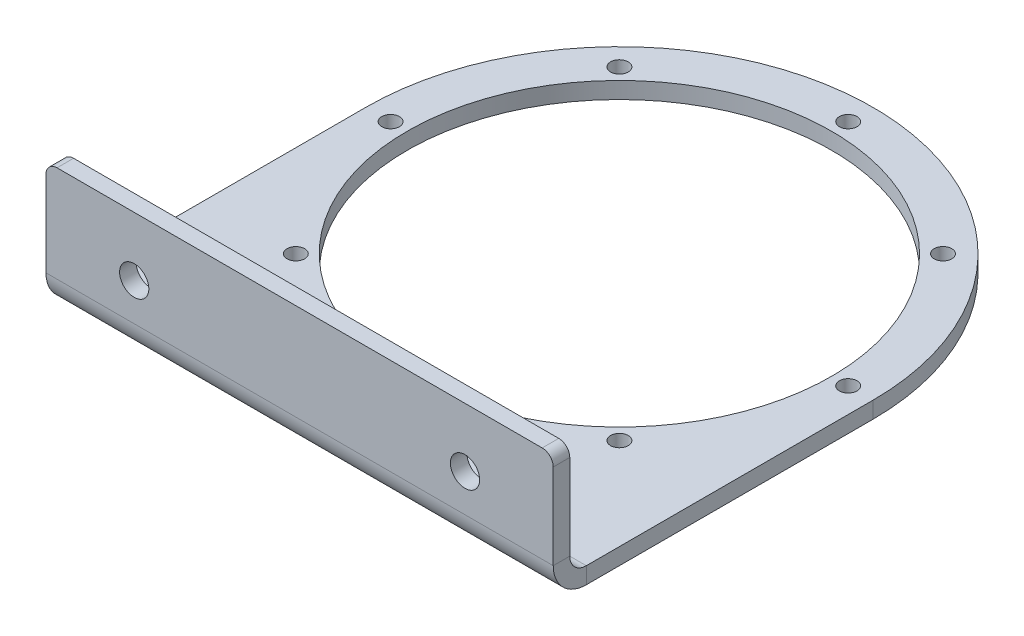
ISO-10303-21;
HEADER;
FILE_DESCRIPTION(('STEP AP214'),'2;1');
FILE_NAME('part.step','',(''),(''),'','','');
FILE_SCHEMA(('AUTOMOTIVE_DESIGN { 1 0 10303 214 1 1 1 1 }'));
ENDSEC;
DATA;
#1=APPLICATION_CONTEXT('core data for automotive mechanical design processes');
#2=APPLICATION_PROTOCOL_DEFINITION('international standard','automotive_design',2000,#1);
#3=PRODUCT_CONTEXT('',#1,'mechanical');
#4=PRODUCT('Part','Part','',(#3));
#5=PRODUCT_RELATED_PRODUCT_CATEGORY('part','',(#4));
#6=PRODUCT_DEFINITION_FORMATION('','',#4);
#7=PRODUCT_DEFINITION_CONTEXT('part definition',#1,'design');
#8=PRODUCT_DEFINITION('design','',#6,#7);
#9=PRODUCT_DEFINITION_SHAPE('','',#8);
#10=(LENGTH_UNIT() NAMED_UNIT(*) SI_UNIT(.MILLI.,.METRE.));
#11=(NAMED_UNIT(*) PLANE_ANGLE_UNIT() SI_UNIT($,.RADIAN.));
#12=(NAMED_UNIT(*) SI_UNIT($,.STERADIAN.) SOLID_ANGLE_UNIT());
#13=UNCERTAINTY_MEASURE_WITH_UNIT(LENGTH_MEASURE(1.E-05),#10,'distance_accuracy_value','');
#14=(GEOMETRIC_REPRESENTATION_CONTEXT(3) GLOBAL_UNCERTAINTY_ASSIGNED_CONTEXT((#13)) GLOBAL_UNIT_ASSIGNED_CONTEXT((#10,
#11,#12)) REPRESENTATION_CONTEXT('',''));
#15=CARTESIAN_POINT('',(0.,0.,0.));
#16=DIRECTION('',(0.,0.,1.));
#17=DIRECTION('',(1.,0.,0.));
#18=AXIS2_PLACEMENT_3D('',#15,#16,#17);
#19=CARTESIAN_POINT('',(46.,-3.,55.));
#20=DIRECTION('',(1.,0.,0.));
#21=DIRECTION('',(0.,0.,-1.));
#22=AXIS2_PLACEMENT_3D('',#19,#20,#21);
#23=PLANE('',#22);
#24=DIRECTION('',(0.,0.,-1.));
#25=VECTOR('',#24,1.);
#26=CARTESIAN_POINT('',(46.,0.,55.));
#27=LINE('',#26,#25);
#28=CARTESIAN_POINT('',(46.,0.,52.));
#29=VERTEX_POINT('',#28);
#30=CARTESIAN_POINT('',(46.,0.,0.));
#31=VERTEX_POINT('',#30);
#32=EDGE_CURVE('E195',#29,#31,#27,.T.);
#33=ORIENTED_EDGE('',*,*,#32,.F.);
#34=DIRECTION('',(0.,-1.,0.));
#35=VECTOR('',#34,1.);
#36=CARTESIAN_POINT('',(46.,0.,52.));
#37=LINE('',#36,#35);
#38=CARTESIAN_POINT('',(46.,-3.00000000000001,52.));
#39=VERTEX_POINT('',#38);
#40=EDGE_CURVE('E171',#29,#39,#37,.T.);
#41=ORIENTED_EDGE('',*,*,#40,.T.);
#42=DIRECTION('',(0.,0.,-1.));
#43=VECTOR('',#42,1.);
#44=CARTESIAN_POINT('',(46.,-3.,55.));
#45=LINE('',#44,#43);
#46=CARTESIAN_POINT('',(46.,-3.,0.));
#47=VERTEX_POINT('',#46);
#48=EDGE_CURVE('E198',#39,#47,#45,.T.);
#49=ORIENTED_EDGE('',*,*,#48,.T.);
#50=DIRECTION('',(0.,1.,0.));
#51=VECTOR('',#50,1.);
#52=CARTESIAN_POINT('',(46.,-3.,0.));
#53=LINE('',#52,#51);
#54=EDGE_CURVE('E207',#47,#31,#53,.T.);
#55=ORIENTED_EDGE('',*,*,#54,.T.);
#56=EDGE_LOOP('',(#33,#41,#49,#55));
#57=FACE_BOUND('',#56,.T.);
#58=ADVANCED_FACE('F45',(#57),#23,.T.);
#59=CARTESIAN_POINT('',(0.,-3.,0.));
#60=DIRECTION('',(0.,1.,0.));
#61=DIRECTION('',(0.,0.,1.));
#62=AXIS2_PLACEMENT_3D('',#59,#60,#61);
#63=PLANE('',#62);
#64=CARTESIAN_POINT('',(-29.3449314192417,-3.,-29.3449314192417));
#65=DIRECTION('',(0.,1.,0.));
#66=DIRECTION('',(0.,0.,1.));
#67=AXIS2_PLACEMENT_3D('',#64,#65,#66);
#68=CIRCLE('',#67,1.59999999999998);
#69=CARTESIAN_POINT('',(-29.3449314192417,-3.,-27.7449314192417));
#70=VERTEX_POINT('',#69);
#71=EDGE_CURVE('E229',#70,#70,#68,.T.);
#72=ORIENTED_EDGE('',*,*,#71,.T.);
#73=EDGE_LOOP('',(#72));
#74=FACE_BOUND('',#73,.T.);
#75=CARTESIAN_POINT('',(0.,-3.,-41.5));
#76=DIRECTION('',(0.,1.,0.));
#77=DIRECTION('',(0.,0.,1.));
#78=AXIS2_PLACEMENT_3D('',#75,#76,#77);
#79=CIRCLE('',#78,1.59999999999998);
#80=CARTESIAN_POINT('',(0.,-3.,-39.9));
#81=VERTEX_POINT('',#80);
#82=EDGE_CURVE('E244',#81,#81,#79,.T.);
#83=ORIENTED_EDGE('',*,*,#82,.T.);
#84=EDGE_LOOP('',(#83));
#85=FACE_BOUND('',#84,.T.);
#86=CARTESIAN_POINT('',(-41.5,-3.,0.));
#87=DIRECTION('',(0.,1.,0.));
#88=DIRECTION('',(0.,0.,1.));
#89=AXIS2_PLACEMENT_3D('',#86,#87,#88);
#90=CIRCLE('',#89,1.59999999999998);
#91=CARTESIAN_POINT('',(-41.5,-3.,1.59999999999999));
#92=VERTEX_POINT('',#91);
#93=EDGE_CURVE('E250',#92,#92,#90,.T.);
#94=ORIENTED_EDGE('',*,*,#93,.T.);
#95=EDGE_LOOP('',(#94));
#96=FACE_BOUND('',#95,.T.);
#97=CARTESIAN_POINT('',(-29.3449314192417,-3.,29.3449314192417));
#98=DIRECTION('',(0.,1.,0.));
#99=DIRECTION('',(0.,0.,1.));
#100=AXIS2_PLACEMENT_3D('',#97,#98,#99);
#101=CIRCLE('',#100,1.59999999999998);
#102=CARTESIAN_POINT('',(-29.3449314192417,-3.,30.9449314192417));
#103=VERTEX_POINT('',#102);
#104=EDGE_CURVE('E256',#103,#103,#101,.T.);
#105=ORIENTED_EDGE('',*,*,#104,.T.);
#106=EDGE_LOOP('',(#105));
#107=FACE_BOUND('',#106,.T.);
#108=CARTESIAN_POINT('',(0.,-3.,41.5));
#109=DIRECTION('',(0.,1.,0.));
#110=DIRECTION('',(0.,0.,1.));
#111=AXIS2_PLACEMENT_3D('',#108,#109,#110);
#112=CIRCLE('',#111,1.59999999999998);
#113=CARTESIAN_POINT('',(0.,-3.,43.1));
#114=VERTEX_POINT('',#113);
#115=EDGE_CURVE('E262',#114,#114,#112,.T.);
#116=ORIENTED_EDGE('',*,*,#115,.T.);
#117=EDGE_LOOP('',(#116));
#118=FACE_BOUND('',#117,.T.);
#119=CARTESIAN_POINT('',(29.3449314192417,-3.,29.3449314192417));
#120=DIRECTION('',(0.,1.,0.));
#121=DIRECTION('',(0.,0.,1.));
#122=AXIS2_PLACEMENT_3D('',#119,#120,#121);
#123=CIRCLE('',#122,1.59999999999998);
#124=CARTESIAN_POINT('',(29.3449314192417,-3.,30.9449314192417));
#125=VERTEX_POINT('',#124);
#126=EDGE_CURVE('E268',#125,#125,#123,.T.);
#127=ORIENTED_EDGE('',*,*,#126,.T.);
#128=EDGE_LOOP('',(#127));
#129=FACE_BOUND('',#128,.T.);
#130=CARTESIAN_POINT('',(41.5,-3.,0.));
#131=DIRECTION('',(0.,1.,0.));
#132=DIRECTION('',(0.,0.,1.));
#133=AXIS2_PLACEMENT_3D('',#130,#131,#132);
#134=CIRCLE('',#133,1.59999999999998);
#135=CARTESIAN_POINT('',(41.5,-3.,1.59999999999998));
#136=VERTEX_POINT('',#135);
#137=EDGE_CURVE('E274',#136,#136,#134,.T.);
#138=ORIENTED_EDGE('',*,*,#137,.T.);
#139=EDGE_LOOP('',(#138));
#140=FACE_BOUND('',#139,.T.);
#141=CARTESIAN_POINT('',(29.3449314192417,-3.,-29.3449314192417));
#142=DIRECTION('',(0.,1.,0.));
#143=DIRECTION('',(0.,0.,1.));
#144=AXIS2_PLACEMENT_3D('',#141,#142,#143);
#145=CIRCLE('',#144,1.59999999999998);
#146=CARTESIAN_POINT('',(29.3449314192417,-3.,-27.7449314192417));
#147=VERTEX_POINT('',#146);
#148=EDGE_CURVE('E280',#147,#147,#145,.T.);
#149=ORIENTED_EDGE('',*,*,#148,.T.);
#150=EDGE_LOOP('',(#149));
#151=FACE_BOUND('',#150,.T.);
#152=CARTESIAN_POINT('',(0.,-3.,0.));
#153=DIRECTION('',(0.,1.,0.));
#154=DIRECTION('',(0.,0.,1.));
#155=AXIS2_PLACEMENT_3D('',#152,#153,#154);
#156=CIRCLE('',#155,38.5);
#157=CARTESIAN_POINT('',(0.,-3.,38.5));
#158=VERTEX_POINT('',#157);
#159=EDGE_CURVE('E185',#158,#158,#156,.T.);
#160=ORIENTED_EDGE('',*,*,#159,.T.);
#161=EDGE_LOOP('',(#160));
#162=FACE_BOUND('',#161,.T.);
#163=DIRECTION('',(1.,0.,0.));
#164=VECTOR('',#163,1.);
#165=CARTESIAN_POINT('',(46.,-3.00000000000001,52.));
#166=LINE('',#165,#164);
#167=CARTESIAN_POINT('',(-46.,-3.,52.));
#168=VERTEX_POINT('',#167);
#169=EDGE_CURVE('E135',#39,#168,#166,.F.);
#170=ORIENTED_EDGE('',*,*,#169,.T.);
#171=DIRECTION('',(0.,0.,1.));
#172=VECTOR('',#171,1.);
#173=CARTESIAN_POINT('',(-46.,-3.,0.));
#174=LINE('',#173,#172);
#175=CARTESIAN_POINT('',(-46.,-3.,0.));
#176=VERTEX_POINT('',#175);
#177=EDGE_CURVE('E194',#176,#168,#174,.T.);
#178=ORIENTED_EDGE('',*,*,#177,.F.);
#179=CARTESIAN_POINT('',(0.,-3.,0.));
#180=DIRECTION('',(0.,1.,0.));
#181=DIRECTION('',(0.,0.,1.));
#182=AXIS2_PLACEMENT_3D('',#179,#180,#181);
#183=CIRCLE('',#182,46.);
#184=EDGE_CURVE('E191',#47,#176,#183,.T.);
#185=ORIENTED_EDGE('',*,*,#184,.F.);
#186=ORIENTED_EDGE('',*,*,#48,.F.);
#187=EDGE_LOOP('',(#170,#178,#185,#186));
#188=FACE_BOUND('',#187,.T.);
#189=ADVANCED_FACE('F317',(#74,#85,#96,#107,#118,#129,#140,#151,#162,#188),#63,.F.);
#190=CARTESIAN_POINT('',(0.,0.,0.));
#191=DIRECTION('',(0.,1.,0.));
#192=DIRECTION('',(0.,0.,1.));
#193=AXIS2_PLACEMENT_3D('',#190,#191,#192);
#194=PLANE('',#193);
#195=CARTESIAN_POINT('',(-29.3449314192417,0.,-29.3449314192417));
#196=DIRECTION('',(0.,1.,0.));
#197=DIRECTION('',(0.,0.,1.));
#198=AXIS2_PLACEMENT_3D('',#195,#196,#197);
#199=CIRCLE('',#198,1.59999999999999);
#200=CARTESIAN_POINT('',(-29.3449314192417,0.,-27.7449314192417));
#201=VERTEX_POINT('',#200);
#202=EDGE_CURVE('E224',#201,#201,#199,.T.);
#203=ORIENTED_EDGE('',*,*,#202,.F.);
#204=EDGE_LOOP('',(#203));
#205=FACE_BOUND('',#204,.T.);
#206=CARTESIAN_POINT('',(0.,0.,-41.5));
#207=DIRECTION('',(0.,1.,0.));
#208=DIRECTION('',(0.,0.,1.));
#209=AXIS2_PLACEMENT_3D('',#206,#207,#208);
#210=CIRCLE('',#209,1.59999999999999);
#211=CARTESIAN_POINT('',(0.,0.,-39.9));
#212=VERTEX_POINT('',#211);
#213=EDGE_CURVE('E241',#212,#212,#210,.T.);
#214=ORIENTED_EDGE('',*,*,#213,.F.);
#215=EDGE_LOOP('',(#214));
#216=FACE_BOUND('',#215,.T.);
#217=CARTESIAN_POINT('',(-41.5,0.,0.));
#218=DIRECTION('',(0.,1.,0.));
#219=DIRECTION('',(0.,0.,1.));
#220=AXIS2_PLACEMENT_3D('',#217,#218,#219);
#221=CIRCLE('',#220,1.59999999999999);
#222=CARTESIAN_POINT('',(-41.5,0.,1.6));
#223=VERTEX_POINT('',#222);
#224=EDGE_CURVE('E247',#223,#223,#221,.T.);
#225=ORIENTED_EDGE('',*,*,#224,.F.);
#226=EDGE_LOOP('',(#225));
#227=FACE_BOUND('',#226,.T.);
#228=CARTESIAN_POINT('',(-29.3449314192417,0.,29.3449314192417));
#229=DIRECTION('',(0.,1.,0.));
#230=DIRECTION('',(0.,0.,1.));
#231=AXIS2_PLACEMENT_3D('',#228,#229,#230);
#232=CIRCLE('',#231,1.59999999999999);
#233=CARTESIAN_POINT('',(-29.3449314192417,0.,30.9449314192417));
#234=VERTEX_POINT('',#233);
#235=EDGE_CURVE('E253',#234,#234,#232,.T.);
#236=ORIENTED_EDGE('',*,*,#235,.F.);
#237=EDGE_LOOP('',(#236));
#238=FACE_BOUND('',#237,.T.);
#239=CARTESIAN_POINT('',(0.,0.,41.5));
#240=DIRECTION('',(0.,1.,0.));
#241=DIRECTION('',(0.,0.,1.));
#242=AXIS2_PLACEMENT_3D('',#239,#240,#241);
#243=CIRCLE('',#242,1.59999999999999);
#244=CARTESIAN_POINT('',(0.,0.,43.1));
#245=VERTEX_POINT('',#244);
#246=EDGE_CURVE('E259',#245,#245,#243,.T.);
#247=ORIENTED_EDGE('',*,*,#246,.F.);
#248=EDGE_LOOP('',(#247));
#249=FACE_BOUND('',#248,.T.);
#250=CARTESIAN_POINT('',(29.3449314192417,0.,29.3449314192417));
#251=DIRECTION('',(0.,1.,0.));
#252=DIRECTION('',(0.,0.,1.));
#253=AXIS2_PLACEMENT_3D('',#250,#251,#252);
#254=CIRCLE('',#253,1.59999999999999);
#255=CARTESIAN_POINT('',(29.3449314192417,0.,30.9449314192417));
#256=VERTEX_POINT('',#255);
#257=EDGE_CURVE('E265',#256,#256,#254,.T.);
#258=ORIENTED_EDGE('',*,*,#257,.F.);
#259=EDGE_LOOP('',(#258));
#260=FACE_BOUND('',#259,.T.);
#261=CARTESIAN_POINT('',(41.5,0.,0.));
#262=DIRECTION('',(0.,1.,0.));
#263=DIRECTION('',(0.,0.,1.));
#264=AXIS2_PLACEMENT_3D('',#261,#262,#263);
#265=CIRCLE('',#264,1.59999999999999);
#266=CARTESIAN_POINT('',(41.5,0.,1.59999999999999));
#267=VERTEX_POINT('',#266);
#268=EDGE_CURVE('E271',#267,#267,#265,.T.);
#269=ORIENTED_EDGE('',*,*,#268,.F.);
#270=EDGE_LOOP('',(#269));
#271=FACE_BOUND('',#270,.T.);
#272=CARTESIAN_POINT('',(29.3449314192417,0.,-29.3449314192417));
#273=DIRECTION('',(0.,1.,0.));
#274=DIRECTION('',(0.,0.,1.));
#275=AXIS2_PLACEMENT_3D('',#272,#273,#274);
#276=CIRCLE('',#275,1.59999999999999);
#277=CARTESIAN_POINT('',(29.3449314192417,0.,-27.7449314192417));
#278=VERTEX_POINT('',#277);
#279=EDGE_CURVE('E277',#278,#278,#276,.T.);
#280=ORIENTED_EDGE('',*,*,#279,.F.);
#281=EDGE_LOOP('',(#280));
#282=FACE_BOUND('',#281,.T.);
#283=CARTESIAN_POINT('',(0.,0.,0.));
#284=DIRECTION('',(0.,1.,0.));
#285=DIRECTION('',(0.,0.,1.));
#286=AXIS2_PLACEMENT_3D('',#283,#284,#285);
#287=CIRCLE('',#286,38.5);
#288=CARTESIAN_POINT('',(0.,0.,38.5));
#289=VERTEX_POINT('',#288);
#290=EDGE_CURVE('E182',#289,#289,#287,.T.);
#291=ORIENTED_EDGE('',*,*,#290,.F.);
#292=EDGE_LOOP('',(#291));
#293=FACE_BOUND('',#292,.T.);
#294=DIRECTION('',(0.,0.,1.));
#295=VECTOR('',#294,1.);
#296=CARTESIAN_POINT('',(-46.,0.,0.));
#297=LINE('',#296,#295);
#298=CARTESIAN_POINT('',(-46.,0.,0.));
#299=VERTEX_POINT('',#298);
#300=CARTESIAN_POINT('',(-46.,0.,52.));
#301=VERTEX_POINT('',#300);
#302=EDGE_CURVE('E203',#299,#301,#297,.T.);
#303=ORIENTED_EDGE('',*,*,#302,.T.);
#304=DIRECTION('',(1.,0.,0.));
#305=VECTOR('',#304,1.);
#306=CARTESIAN_POINT('',(46.,0.,52.));
#307=LINE('',#306,#305);
#308=EDGE_CURVE('E175',#29,#301,#307,.F.);
#309=ORIENTED_EDGE('',*,*,#308,.F.);
#310=ORIENTED_EDGE('',*,*,#32,.T.);
#311=CARTESIAN_POINT('',(0.,0.,0.));
#312=DIRECTION('',(0.,1.,0.));
#313=DIRECTION('',(0.,0.,1.));
#314=AXIS2_PLACEMENT_3D('',#311,#312,#313);
#315=CIRCLE('',#314,46.);
#316=EDGE_CURVE('E188',#31,#299,#315,.T.);
#317=ORIENTED_EDGE('',*,*,#316,.T.);
#318=EDGE_LOOP('',(#303,#309,#310,#317));
#319=FACE_BOUND('',#318,.T.);
#320=ADVANCED_FACE('F324',(#205,#216,#227,#238,#249,#260,#271,#282,#293,#319),#194,.T.);
#321=CARTESIAN_POINT('',(0.,-3.,0.));
#322=DIRECTION('',(0.,1.,0.));
#323=DIRECTION('',(0.,0.,1.));
#324=AXIS2_PLACEMENT_3D('',#321,#322,#323);
#325=CYLINDRICAL_SURFACE('',#324,46.);
#326=ORIENTED_EDGE('',*,*,#316,.F.);
#327=ORIENTED_EDGE('',*,*,#54,.F.);
#328=ORIENTED_EDGE('',*,*,#184,.T.);
#329=DIRECTION('',(0.,1.,0.));
#330=VECTOR('',#329,1.);
#331=CARTESIAN_POINT('',(-46.,-3.,0.));
#332=LINE('',#331,#330);
#333=EDGE_CURVE('E200',#176,#299,#332,.T.);
#334=ORIENTED_EDGE('',*,*,#333,.T.);
#335=EDGE_LOOP('',(#326,#327,#328,#334));
#336=FACE_BOUND('',#335,.T.);
#337=ADVANCED_FACE('F333',(#336),#325,.T.);
#338=CARTESIAN_POINT('',(-46.,-3.,0.));
#339=DIRECTION('',(-1.,0.,0.));
#340=DIRECTION('',(0.,0.,1.));
#341=AXIS2_PLACEMENT_3D('',#338,#339,#340);
#342=PLANE('',#341);
#343=DIRECTION('',(0.,-1.,0.));
#344=VECTOR('',#343,1.);
#345=CARTESIAN_POINT('',(-46.,0.,52.));
#346=LINE('',#345,#344);
#347=EDGE_CURVE('E179',#301,#168,#346,.T.);
#348=ORIENTED_EDGE('',*,*,#347,.F.);
#349=ORIENTED_EDGE('',*,*,#302,.F.);
#350=ORIENTED_EDGE('',*,*,#333,.F.);
#351=ORIENTED_EDGE('',*,*,#177,.T.);
#352=EDGE_LOOP('',(#348,#349,#350,#351));
#353=FACE_BOUND('',#352,.T.);
#354=ADVANCED_FACE('F330',(#353),#342,.T.);
#355=CARTESIAN_POINT('',(0.,-3.,0.));
#356=DIRECTION('',(0.,1.,0.));
#357=DIRECTION('',(0.,0.,1.));
#358=AXIS2_PLACEMENT_3D('',#355,#356,#357);
#359=CYLINDRICAL_SURFACE('',#358,38.5);
#360=ORIENTED_EDGE('',*,*,#159,.F.);
#361=EDGE_LOOP('',(#360));
#362=FACE_BOUND('',#361,.T.);
#363=ORIENTED_EDGE('',*,*,#290,.T.);
#364=EDGE_LOOP('',(#363));
#365=FACE_BOUND('',#364,.T.);
#366=ADVANCED_FACE('F332',(#362,#365),#359,.F.);
#367=CARTESIAN_POINT('',(-46.,2.99999999999999,52.));
#368=DIRECTION('',(-1.,0.,0.));
#369=DIRECTION('',(0.,0.,1.));
#370=AXIS2_PLACEMENT_3D('',#367,#368,#369);
#371=PLANE('',#370);
#372=DIRECTION('',(0.,0.,1.));
#373=VECTOR('',#372,1.);
#374=CARTESIAN_POINT('',(-46.,2.99999999999999,55.));
#375=LINE('',#374,#373);
#376=CARTESIAN_POINT('',(-46.,2.99999999999999,55.));
#377=VERTEX_POINT('',#376);
#378=CARTESIAN_POINT('',(-46.,2.99999999999999,58.));
#379=VERTEX_POINT('',#378);
#380=EDGE_CURVE('E162',#377,#379,#375,.T.);
#381=ORIENTED_EDGE('',*,*,#380,.F.);
#382=CARTESIAN_POINT('',(-46.,2.99999999999999,52.));
#383=DIRECTION('',(1.,0.,0.));
#384=DIRECTION('',(0.,0.,-1.));
#385=AXIS2_PLACEMENT_3D('',#382,#383,#384);
#386=CIRCLE('',#385,3.);
#387=EDGE_CURVE('E138',#301,#377,#386,.F.);
#388=ORIENTED_EDGE('',*,*,#387,.F.);
#389=ORIENTED_EDGE('',*,*,#347,.T.);
#390=CARTESIAN_POINT('',(-46.,2.99999999999999,52.));
#391=DIRECTION('',(1.,0.,0.));
#392=DIRECTION('',(0.,0.,-1.));
#393=AXIS2_PLACEMENT_3D('',#390,#391,#392);
#394=CIRCLE('',#393,6.);
#395=EDGE_CURVE('E170',#168,#379,#394,.F.);
#396=ORIENTED_EDGE('',*,*,#395,.T.);
#397=EDGE_LOOP('',(#381,#388,#389,#396));
#398=FACE_BOUND('',#397,.T.);
#399=ADVANCED_FACE('F293',(#398),#371,.T.);
#400=CARTESIAN_POINT('',(46.,2.99999999999999,52.));
#401=DIRECTION('',(-1.,0.,0.));
#402=DIRECTION('',(0.,0.,1.));
#403=AXIS2_PLACEMENT_3D('',#400,#401,#402);
#404=PLANE('',#403);
#405=CARTESIAN_POINT('',(46.,2.99999999999999,52.));
#406=DIRECTION('',(1.,0.,0.));
#407=DIRECTION('',(0.,0.,-1.));
#408=AXIS2_PLACEMENT_3D('',#405,#406,#407);
#409=CIRCLE('',#408,3.);
#410=CARTESIAN_POINT('',(46.,2.99999999999999,55.));
#411=VERTEX_POINT('',#410);
#412=EDGE_CURVE('E145',#411,#29,#409,.T.);
#413=ORIENTED_EDGE('',*,*,#412,.F.);
#414=DIRECTION('',(0.,0.,1.));
#415=VECTOR('',#414,1.);
#416=CARTESIAN_POINT('',(46.,2.99999999999999,55.));
#417=LINE('',#416,#415);
#418=CARTESIAN_POINT('',(46.,2.99999999999999,58.));
#419=VERTEX_POINT('',#418);
#420=EDGE_CURVE('E142',#411,#419,#417,.T.);
#421=ORIENTED_EDGE('',*,*,#420,.T.);
#422=CARTESIAN_POINT('',(46.,2.99999999999999,52.));
#423=DIRECTION('',(1.,0.,0.));
#424=DIRECTION('',(0.,0.,-1.));
#425=AXIS2_PLACEMENT_3D('',#422,#423,#424);
#426=CIRCLE('',#425,6.);
#427=EDGE_CURVE('E128',#419,#39,#426,.T.);
#428=ORIENTED_EDGE('',*,*,#427,.T.);
#429=ORIENTED_EDGE('',*,*,#40,.F.);
#430=EDGE_LOOP('',(#413,#421,#428,#429));
#431=FACE_BOUND('',#430,.T.);
#432=ADVANCED_FACE('F143',(#431),#404,.F.);
#433=CARTESIAN_POINT('',(46.,2.99999999999999,52.));
#434=DIRECTION('',(1.,0.,0.));
#435=DIRECTION('',(0.,0.,1.));
#436=AXIS2_PLACEMENT_3D('',#433,#434,#435);
#437=CYLINDRICAL_SURFACE('',#436,6.);
#438=ORIENTED_EDGE('',*,*,#169,.F.);
#439=ORIENTED_EDGE('',*,*,#427,.F.);
#440=DIRECTION('',(-1.,0.,0.));
#441=VECTOR('',#440,1.);
#442=CARTESIAN_POINT('',(0.,2.99999999999999,58.));
#443=LINE('',#442,#441);
#444=EDGE_CURVE('E133',#419,#379,#443,.T.);
#445=ORIENTED_EDGE('',*,*,#444,.T.);
#446=ORIENTED_EDGE('',*,*,#395,.F.);
#447=EDGE_LOOP('',(#438,#439,#445,#446));
#448=FACE_BOUND('',#447,.T.);
#449=ADVANCED_FACE('F130',(#448),#437,.T.);
#450=CARTESIAN_POINT('',(46.,2.99999999999999,52.));
#451=DIRECTION('',(1.,0.,0.));
#452=DIRECTION('',(0.,0.,1.));
#453=AXIS2_PLACEMENT_3D('',#450,#451,#452);
#454=CYLINDRICAL_SURFACE('',#453,3.);
#455=ORIENTED_EDGE('',*,*,#308,.T.);
#456=ORIENTED_EDGE('',*,*,#387,.T.);
#457=DIRECTION('',(1.,0.,0.));
#458=VECTOR('',#457,1.);
#459=CARTESIAN_POINT('',(-46.,2.99999999999999,55.));
#460=LINE('',#459,#458);
#461=EDGE_CURVE('E147',#377,#411,#460,.T.);
#462=ORIENTED_EDGE('',*,*,#461,.T.);
#463=ORIENTED_EDGE('',*,*,#412,.T.);
#464=EDGE_LOOP('',(#455,#456,#462,#463));
#465=FACE_BOUND('',#464,.T.);
#466=ADVANCED_FACE('F294',(#465),#454,.F.);
#467=CARTESIAN_POINT('',(0.,0.,58.));
#468=DIRECTION('',(0.,0.,-1.));
#469=DIRECTION('',(-1.,0.,0.));
#470=AXIS2_PLACEMENT_3D('',#467,#468,#469);
#471=PLANE('',#470);
#472=CARTESIAN_POINT('',(-30.,9.8,58.));
#473=DIRECTION('',(0.,0.,1.));
#474=DIRECTION('',(1.,0.,0.));
#475=AXIS2_PLACEMENT_3D('',#472,#473,#474);
#476=CIRCLE('',#475,2.64999999999998);
#477=CARTESIAN_POINT('',(-27.35,9.8,58.));
#478=VERTEX_POINT('',#477);
#479=EDGE_CURVE('E236',#478,#478,#476,.T.);
#480=ORIENTED_EDGE('',*,*,#479,.F.);
#481=EDGE_LOOP('',(#480));
#482=FACE_BOUND('',#481,.T.);
#483=CARTESIAN_POINT('',(30.,9.8,58.));
#484=DIRECTION('',(0.,0.,1.));
#485=DIRECTION('',(1.,0.,0.));
#486=AXIS2_PLACEMENT_3D('',#483,#484,#485);
#487=CIRCLE('',#486,2.64999999999999);
#488=CARTESIAN_POINT('',(32.65,9.8,58.));
#489=VERTEX_POINT('',#488);
#490=EDGE_CURVE('E225',#489,#489,#487,.T.);
#491=ORIENTED_EDGE('',*,*,#490,.F.);
#492=EDGE_LOOP('',(#491));
#493=FACE_BOUND('',#492,.T.);
#494=DIRECTION('',(0.,1.,0.));
#495=VECTOR('',#494,1.);
#496=CARTESIAN_POINT('',(46.,20.5,58.));
#497=LINE('',#496,#495);
#498=CARTESIAN_POINT('',(46.,18.5,58.));
#499=VERTEX_POINT('',#498);
#500=EDGE_CURVE('E149',#419,#499,#497,.T.);
#501=ORIENTED_EDGE('',*,*,#500,.T.);
#502=CARTESIAN_POINT('',(44.,18.5,58.));
#503=DIRECTION('',(0.,0.,-1.));
#504=DIRECTION('',(-1.,0.,0.));
#505=AXIS2_PLACEMENT_3D('',#502,#503,#504);
#506=CIRCLE('',#505,2.);
#507=CARTESIAN_POINT('',(44.,20.5,58.));
#508=VERTEX_POINT('',#507);
#509=EDGE_CURVE('E54',#499,#508,#506,.F.);
#510=ORIENTED_EDGE('',*,*,#509,.T.);
#511=DIRECTION('',(-1.,0.,0.));
#512=VECTOR('',#511,1.);
#513=CARTESIAN_POINT('',(-46.,20.5,58.));
#514=LINE('',#513,#512);
#515=CARTESIAN_POINT('',(-44.,20.5,58.));
#516=VERTEX_POINT('',#515);
#517=EDGE_CURVE('E152',#508,#516,#514,.T.);
#518=ORIENTED_EDGE('',*,*,#517,.T.);
#519=CARTESIAN_POINT('',(-44.,18.5,58.));
#520=DIRECTION('',(0.,0.,-1.));
#521=DIRECTION('',(-1.,0.,0.));
#522=AXIS2_PLACEMENT_3D('',#519,#520,#521);
#523=CIRCLE('',#522,2.);
#524=CARTESIAN_POINT('',(-46.,18.5,58.));
#525=VERTEX_POINT('',#524);
#526=EDGE_CURVE('E62',#516,#525,#523,.F.);
#527=ORIENTED_EDGE('',*,*,#526,.T.);
#528=DIRECTION('',(0.,-1.,0.));
#529=VECTOR('',#528,1.);
#530=CARTESIAN_POINT('',(-46.,0.,58.));
#531=LINE('',#530,#529);
#532=EDGE_CURVE('E153',#525,#379,#531,.T.);
#533=ORIENTED_EDGE('',*,*,#532,.T.);
#534=ORIENTED_EDGE('',*,*,#444,.F.);
#535=EDGE_LOOP('',(#501,#510,#518,#527,#533,#534));
#536=FACE_BOUND('',#535,.T.);
#537=ADVANCED_FACE('F155',(#482,#493,#536),#471,.F.);
#538=CARTESIAN_POINT('',(0.,0.,55.));
#539=DIRECTION('',(0.,0.,-1.));
#540=DIRECTION('',(-1.,0.,0.));
#541=AXIS2_PLACEMENT_3D('',#538,#539,#540);
#542=PLANE('',#541);
#543=CARTESIAN_POINT('',(-30.,9.8,55.));
#544=DIRECTION('',(0.,0.,-1.));
#545=DIRECTION('',(-1.,0.,0.));
#546=AXIS2_PLACEMENT_3D('',#543,#544,#545);
#547=CIRCLE('',#546,2.64999999999997);
#548=CARTESIAN_POINT('',(-32.65,9.8,55.));
#549=VERTEX_POINT('',#548);
#550=EDGE_CURVE('E49',#549,#549,#547,.T.);
#551=ORIENTED_EDGE('',*,*,#550,.F.);
#552=EDGE_LOOP('',(#551));
#553=FACE_BOUND('',#552,.T.);
#554=CARTESIAN_POINT('',(30.,9.8,55.));
#555=DIRECTION('',(0.,0.,-1.));
#556=DIRECTION('',(-1.,0.,0.));
#557=AXIS2_PLACEMENT_3D('',#554,#555,#556);
#558=CIRCLE('',#557,2.64999999999998);
#559=CARTESIAN_POINT('',(27.35,9.8,55.));
#560=VERTEX_POINT('',#559);
#561=EDGE_CURVE('E222',#560,#560,#558,.T.);
#562=ORIENTED_EDGE('',*,*,#561,.F.);
#563=EDGE_LOOP('',(#562));
#564=FACE_BOUND('',#563,.T.);
#565=DIRECTION('',(-1.,0.,0.));
#566=VECTOR('',#565,1.);
#567=CARTESIAN_POINT('',(-46.,20.5,55.));
#568=LINE('',#567,#566);
#569=CARTESIAN_POINT('',(44.,20.5,55.));
#570=VERTEX_POINT('',#569);
#571=CARTESIAN_POINT('',(-44.,20.5,55.));
#572=VERTEX_POINT('',#571);
#573=EDGE_CURVE('E163',#570,#572,#568,.T.);
#574=ORIENTED_EDGE('',*,*,#573,.F.);
#575=CARTESIAN_POINT('',(44.,18.5,55.));
#576=DIRECTION('',(0.,0.,-1.));
#577=DIRECTION('',(-1.,0.,0.));
#578=AXIS2_PLACEMENT_3D('',#575,#576,#577);
#579=CIRCLE('',#578,2.);
#580=CARTESIAN_POINT('',(46.,18.5,55.));
#581=VERTEX_POINT('',#580);
#582=EDGE_CURVE('E218',#570,#581,#579,.T.);
#583=ORIENTED_EDGE('',*,*,#582,.T.);
#584=DIRECTION('',(0.,1.,0.));
#585=VECTOR('',#584,1.);
#586=CARTESIAN_POINT('',(46.,20.5,55.));
#587=LINE('',#586,#585);
#588=EDGE_CURVE('E158',#411,#581,#587,.T.);
#589=ORIENTED_EDGE('',*,*,#588,.F.);
#590=ORIENTED_EDGE('',*,*,#461,.F.);
#591=DIRECTION('',(0.,-1.,0.));
#592=VECTOR('',#591,1.);
#593=CARTESIAN_POINT('',(-46.,0.,55.));
#594=LINE('',#593,#592);
#595=CARTESIAN_POINT('',(-46.,18.5,55.));
#596=VERTEX_POINT('',#595);
#597=EDGE_CURVE('E156',#596,#377,#594,.T.);
#598=ORIENTED_EDGE('',*,*,#597,.F.);
#599=CARTESIAN_POINT('',(-44.,18.5,55.));
#600=DIRECTION('',(0.,0.,-1.));
#601=DIRECTION('',(-1.,0.,0.));
#602=AXIS2_PLACEMENT_3D('',#599,#600,#601);
#603=CIRCLE('',#602,2.);
#604=EDGE_CURVE('E216',#596,#572,#603,.T.);
#605=ORIENTED_EDGE('',*,*,#604,.T.);
#606=EDGE_LOOP('',(#574,#583,#589,#590,#598,#605));
#607=FACE_BOUND('',#606,.T.);
#608=ADVANCED_FACE('F297',(#553,#564,#607),#542,.T.);
#609=CARTESIAN_POINT('',(-46.,0.,58.));
#610=DIRECTION('',(1.,0.,0.));
#611=DIRECTION('',(0.,0.,-1.));
#612=AXIS2_PLACEMENT_3D('',#609,#610,#611);
#613=PLANE('',#612);
#614=ORIENTED_EDGE('',*,*,#532,.F.);
#615=DIRECTION('',(0.,0.,-1.));
#616=VECTOR('',#615,1.);
#617=CARTESIAN_POINT('',(-46.,18.5,58.));
#618=LINE('',#617,#616);
#619=EDGE_CURVE('E11',#525,#596,#618,.T.);
#620=ORIENTED_EDGE('',*,*,#619,.T.);
#621=ORIENTED_EDGE('',*,*,#597,.T.);
#622=ORIENTED_EDGE('',*,*,#380,.T.);
#623=EDGE_LOOP('',(#614,#620,#621,#622));
#624=FACE_BOUND('',#623,.T.);
#625=ADVANCED_FACE('F288',(#624),#613,.F.);
#626=CARTESIAN_POINT('',(46.,20.5,58.));
#627=DIRECTION('',(-1.,0.,0.));
#628=DIRECTION('',(0.,0.,1.));
#629=AXIS2_PLACEMENT_3D('',#626,#627,#628);
#630=PLANE('',#629);
#631=ORIENTED_EDGE('',*,*,#588,.T.);
#632=DIRECTION('',(0.,0.,-1.));
#633=VECTOR('',#632,1.);
#634=CARTESIAN_POINT('',(46.,18.5,58.));
#635=LINE('',#634,#633);
#636=EDGE_CURVE('E70',#581,#499,#635,.F.);
#637=ORIENTED_EDGE('',*,*,#636,.T.);
#638=ORIENTED_EDGE('',*,*,#500,.F.);
#639=ORIENTED_EDGE('',*,*,#420,.F.);
#640=EDGE_LOOP('',(#631,#637,#638,#639));
#641=FACE_BOUND('',#640,.T.);
#642=ADVANCED_FACE('F150',(#641),#630,.F.);
#643=CARTESIAN_POINT('',(-46.,20.5,58.));
#644=DIRECTION('',(0.,-1.,0.));
#645=DIRECTION('',(0.,0.,-1.));
#646=AXIS2_PLACEMENT_3D('',#643,#644,#645);
#647=PLANE('',#646);
#648=ORIENTED_EDGE('',*,*,#517,.F.);
#649=DIRECTION('',(0.,0.,-1.));
#650=VECTOR('',#649,1.);
#651=CARTESIAN_POINT('',(44.,20.5,58.));
#652=LINE('',#651,#650);
#653=EDGE_CURVE('E213',#508,#570,#652,.T.);
#654=ORIENTED_EDGE('',*,*,#653,.T.);
#655=ORIENTED_EDGE('',*,*,#573,.T.);
#656=DIRECTION('',(0.,0.,-1.));
#657=VECTOR('',#656,1.);
#658=CARTESIAN_POINT('',(-44.,20.5,58.));
#659=LINE('',#658,#657);
#660=EDGE_CURVE('E210',#572,#516,#659,.F.);
#661=ORIENTED_EDGE('',*,*,#660,.T.);
#662=EDGE_LOOP('',(#648,#654,#655,#661));
#663=FACE_BOUND('',#662,.T.);
#664=ADVANCED_FACE('F303',(#663),#647,.F.);
#665=CARTESIAN_POINT('',(44.,18.5,58.));
#666=DIRECTION('',(0.,0.,-1.));
#667=DIRECTION('',(-1.,0.,0.));
#668=AXIS2_PLACEMENT_3D('',#665,#666,#667);
#669=CYLINDRICAL_SURFACE('',#668,2.);
#670=ORIENTED_EDGE('',*,*,#509,.F.);
#671=ORIENTED_EDGE('',*,*,#636,.F.);
#672=ORIENTED_EDGE('',*,*,#582,.F.);
#673=ORIENTED_EDGE('',*,*,#653,.F.);
#674=EDGE_LOOP('',(#670,#671,#672,#673));
#675=FACE_BOUND('',#674,.T.);
#676=ADVANCED_FACE('F299',(#675),#669,.T.);
#677=CARTESIAN_POINT('',(-44.,18.5,58.));
#678=DIRECTION('',(0.,0.,-1.));
#679=DIRECTION('',(-1.,0.,0.));
#680=AXIS2_PLACEMENT_3D('',#677,#678,#679);
#681=CYLINDRICAL_SURFACE('',#680,2.);
#682=ORIENTED_EDGE('',*,*,#526,.F.);
#683=ORIENTED_EDGE('',*,*,#660,.F.);
#684=ORIENTED_EDGE('',*,*,#604,.F.);
#685=ORIENTED_EDGE('',*,*,#619,.F.);
#686=EDGE_LOOP('',(#682,#683,#684,#685));
#687=FACE_BOUND('',#686,.T.);
#688=ADVANCED_FACE('F47',(#687),#681,.T.);
#689=CARTESIAN_POINT('',(29.3449314192417,0.,-29.3449314192417));
#690=DIRECTION('',(0.,1.,0.));
#691=DIRECTION('',(0.,0.,1.));
#692=AXIS2_PLACEMENT_3D('',#689,#690,#691);
#693=CYLINDRICAL_SURFACE('',#692,1.59999999999998);
#694=ORIENTED_EDGE('',*,*,#279,.T.);
#695=EDGE_LOOP('',(#694));
#696=FACE_BOUND('',#695,.T.);
#697=ORIENTED_EDGE('',*,*,#148,.F.);
#698=EDGE_LOOP('',(#697));
#699=FACE_BOUND('',#698,.T.);
#700=ADVANCED_FACE('F307',(#696,#699),#693,.F.);
#701=CARTESIAN_POINT('',(41.5,0.,0.));
#702=DIRECTION('',(0.,1.,0.));
#703=DIRECTION('',(0.,0.,1.));
#704=AXIS2_PLACEMENT_3D('',#701,#702,#703);
#705=CYLINDRICAL_SURFACE('',#704,1.59999999999998);
#706=ORIENTED_EDGE('',*,*,#268,.T.);
#707=EDGE_LOOP('',(#706));
#708=FACE_BOUND('',#707,.T.);
#709=ORIENTED_EDGE('',*,*,#137,.F.);
#710=EDGE_LOOP('',(#709));
#711=FACE_BOUND('',#710,.T.);
#712=ADVANCED_FACE('F313',(#708,#711),#705,.F.);
#713=CARTESIAN_POINT('',(29.3449314192417,0.,29.3449314192417));
#714=DIRECTION('',(0.,1.,0.));
#715=DIRECTION('',(0.,0.,1.));
#716=AXIS2_PLACEMENT_3D('',#713,#714,#715);
#717=CYLINDRICAL_SURFACE('',#716,1.59999999999998);
#718=ORIENTED_EDGE('',*,*,#257,.T.);
#719=EDGE_LOOP('',(#718));
#720=FACE_BOUND('',#719,.T.);
#721=ORIENTED_EDGE('',*,*,#126,.F.);
#722=EDGE_LOOP('',(#721));
#723=FACE_BOUND('',#722,.T.);
#724=ADVANCED_FACE('F396',(#720,#723),#717,.F.);
#725=CARTESIAN_POINT('',(0.,0.,41.5));
#726=DIRECTION('',(0.,1.,0.));
#727=DIRECTION('',(0.,0.,1.));
#728=AXIS2_PLACEMENT_3D('',#725,#726,#727);
#729=CYLINDRICAL_SURFACE('',#728,1.59999999999998);
#730=ORIENTED_EDGE('',*,*,#246,.T.);
#731=EDGE_LOOP('',(#730));
#732=FACE_BOUND('',#731,.T.);
#733=ORIENTED_EDGE('',*,*,#115,.F.);
#734=EDGE_LOOP('',(#733));
#735=FACE_BOUND('',#734,.T.);
#736=ADVANCED_FACE('F400',(#732,#735),#729,.F.);
#737=CARTESIAN_POINT('',(-29.3449314192417,0.,29.3449314192417));
#738=DIRECTION('',(0.,1.,0.));
#739=DIRECTION('',(0.,0.,1.));
#740=AXIS2_PLACEMENT_3D('',#737,#738,#739);
#741=CYLINDRICAL_SURFACE('',#740,1.59999999999998);
#742=ORIENTED_EDGE('',*,*,#235,.T.);
#743=EDGE_LOOP('',(#742));
#744=FACE_BOUND('',#743,.T.);
#745=ORIENTED_EDGE('',*,*,#104,.F.);
#746=EDGE_LOOP('',(#745));
#747=FACE_BOUND('',#746,.T.);
#748=ADVANCED_FACE('F404',(#744,#747),#741,.F.);
#749=CARTESIAN_POINT('',(-41.5,0.,0.));
#750=DIRECTION('',(0.,1.,0.));
#751=DIRECTION('',(0.,0.,1.));
#752=AXIS2_PLACEMENT_3D('',#749,#750,#751);
#753=CYLINDRICAL_SURFACE('',#752,1.59999999999998);
#754=ORIENTED_EDGE('',*,*,#224,.T.);
#755=EDGE_LOOP('',(#754));
#756=FACE_BOUND('',#755,.T.);
#757=ORIENTED_EDGE('',*,*,#93,.F.);
#758=EDGE_LOOP('',(#757));
#759=FACE_BOUND('',#758,.T.);
#760=ADVANCED_FACE('F408',(#756,#759),#753,.F.);
#761=CARTESIAN_POINT('',(0.,0.,-41.5));
#762=DIRECTION('',(0.,1.,0.));
#763=DIRECTION('',(0.,0.,1.));
#764=AXIS2_PLACEMENT_3D('',#761,#762,#763);
#765=CYLINDRICAL_SURFACE('',#764,1.59999999999998);
#766=ORIENTED_EDGE('',*,*,#213,.T.);
#767=EDGE_LOOP('',(#766));
#768=FACE_BOUND('',#767,.T.);
#769=ORIENTED_EDGE('',*,*,#82,.F.);
#770=EDGE_LOOP('',(#769));
#771=FACE_BOUND('',#770,.T.);
#772=ADVANCED_FACE('F412',(#768,#771),#765,.F.);
#773=CARTESIAN_POINT('',(-29.3449314192417,0.,-29.3449314192417));
#774=DIRECTION('',(0.,1.,0.));
#775=DIRECTION('',(0.,0.,1.));
#776=AXIS2_PLACEMENT_3D('',#773,#774,#775);
#777=CYLINDRICAL_SURFACE('',#776,1.59999999999998);
#778=ORIENTED_EDGE('',*,*,#202,.T.);
#779=EDGE_LOOP('',(#778));
#780=FACE_BOUND('',#779,.T.);
#781=ORIENTED_EDGE('',*,*,#71,.F.);
#782=EDGE_LOOP('',(#781));
#783=FACE_BOUND('',#782,.T.);
#784=ADVANCED_FACE('F416',(#780,#783),#777,.F.);
#785=CARTESIAN_POINT('',(30.,9.8,58.));
#786=DIRECTION('',(0.,0.,1.));
#787=DIRECTION('',(1.,0.,0.));
#788=AXIS2_PLACEMENT_3D('',#785,#786,#787);
#789=CYLINDRICAL_SURFACE('',#788,2.64999999999998);
#790=ORIENTED_EDGE('',*,*,#561,.T.);
#791=EDGE_LOOP('',(#790));
#792=FACE_BOUND('',#791,.T.);
#793=ORIENTED_EDGE('',*,*,#490,.T.);
#794=EDGE_LOOP('',(#793));
#795=FACE_BOUND('',#794,.T.);
#796=ADVANCED_FACE('F420',(#792,#795),#789,.F.);
#797=CARTESIAN_POINT('',(-30.,9.8,58.));
#798=DIRECTION('',(0.,0.,1.));
#799=DIRECTION('',(1.,0.,0.));
#800=AXIS2_PLACEMENT_3D('',#797,#798,#799);
#801=CYLINDRICAL_SURFACE('',#800,2.64999999999997);
#802=ORIENTED_EDGE('',*,*,#550,.T.);
#803=EDGE_LOOP('',(#802));
#804=FACE_BOUND('',#803,.T.);
#805=ORIENTED_EDGE('',*,*,#479,.T.);
#806=EDGE_LOOP('',(#805));
#807=FACE_BOUND('',#806,.T.);
#808=ADVANCED_FACE('F424',(#804,#807),#801,.F.);
#809=CLOSED_SHELL('',(#58,#189,#320,#337,#354,#366,#399,#432,#449,#466,#537,#608,#625,#642,#664,
#676,#688,#700,#712,#724,#736,#748,#760,#772,#784,#796,#808));
#810=MANIFOLD_SOLID_BREP('B2',#809);
#811=ADVANCED_BREP_SHAPE_REPRESENTATION('',(#18,#810),#14);
#812=SHAPE_DEFINITION_REPRESENTATION(#9,#811);
ENDSEC;
END-ISO-10303-21;
